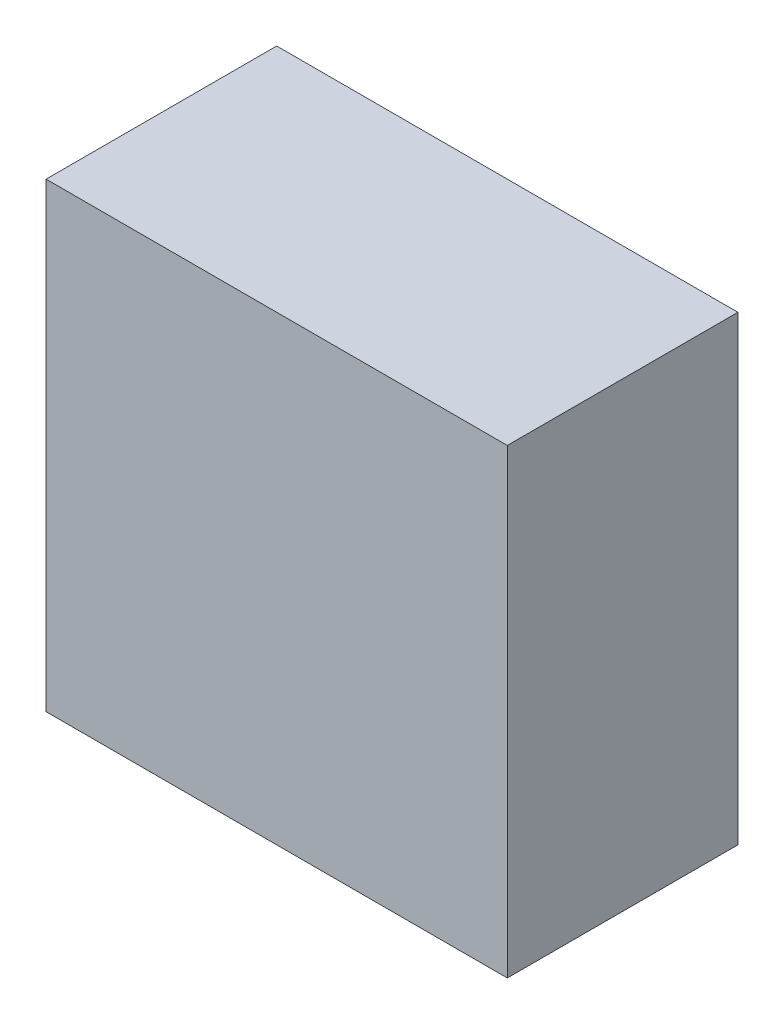
ISO-10303-21;
HEADER;
FILE_DESCRIPTION(('STEP AP214'),'2;1');
FILE_NAME('part.step','',(''),(''),'','','');
FILE_SCHEMA(('AUTOMOTIVE_DESIGN { 1 0 10303 214 1 1 1 1 }'));
ENDSEC;
DATA;
#1=APPLICATION_CONTEXT('core data for automotive mechanical design processes');
#2=APPLICATION_PROTOCOL_DEFINITION('international standard','automotive_design',2000,#1);
#3=PRODUCT_CONTEXT('',#1,'mechanical');
#4=PRODUCT('Part','Part','',(#3));
#5=PRODUCT_RELATED_PRODUCT_CATEGORY('part','',(#4));
#6=PRODUCT_DEFINITION_FORMATION('','',#4);
#7=PRODUCT_DEFINITION_CONTEXT('part definition',#1,'design');
#8=PRODUCT_DEFINITION('design','',#6,#7);
#9=PRODUCT_DEFINITION_SHAPE('','',#8);
#10=(LENGTH_UNIT() NAMED_UNIT(*) SI_UNIT(.MILLI.,.METRE.));
#11=(NAMED_UNIT(*) PLANE_ANGLE_UNIT() SI_UNIT($,.RADIAN.));
#12=(NAMED_UNIT(*) SI_UNIT($,.STERADIAN.) SOLID_ANGLE_UNIT());
#13=UNCERTAINTY_MEASURE_WITH_UNIT(LENGTH_MEASURE(1.E-05),#10,'distance_accuracy_value','');
#14=(GEOMETRIC_REPRESENTATION_CONTEXT(3) GLOBAL_UNCERTAINTY_ASSIGNED_CONTEXT((#13)) GLOBAL_UNIT_ASSIGNED_CONTEXT((#10,
#11,#12)) REPRESENTATION_CONTEXT('',''));
#15=CARTESIAN_POINT('',(0.,0.,0.));
#16=DIRECTION('',(0.,0.,1.));
#17=DIRECTION('',(1.,0.,0.));
#18=AXIS2_PLACEMENT_3D('',#15,#16,#17);
#19=CARTESIAN_POINT('',(10.,-10.,10.));
#20=DIRECTION('',(-1.,0.,0.));
#21=DIRECTION('',(0.,0.,1.));
#22=AXIS2_PLACEMENT_3D('',#19,#20,#21);
#23=PLANE('',#22);
#24=DIRECTION('',(0.,1.,0.));
#25=VECTOR('',#24,1.);
#26=CARTESIAN_POINT('',(10.,-10.,0.));
#27=LINE('',#26,#25);
#28=CARTESIAN_POINT('',(10.,-10.,0.));
#29=VERTEX_POINT('',#28);
#30=CARTESIAN_POINT('',(10.,10.,0.));
#31=VERTEX_POINT('',#30);
#32=EDGE_CURVE('E301',#29,#31,#27,.T.);
#33=ORIENTED_EDGE('',*,*,#32,.T.);
#34=DIRECTION('',(0.,0.,-1.));
#35=VECTOR('',#34,1.);
#36=CARTESIAN_POINT('',(10.,10.,10.));
#37=LINE('',#36,#35);
#38=CARTESIAN_POINT('',(10.,10.,10.));
#39=VERTEX_POINT('',#38);
#40=EDGE_CURVE('E42',#39,#31,#37,.T.);
#41=ORIENTED_EDGE('',*,*,#40,.F.);
#42=DIRECTION('',(0.,1.,0.));
#43=VECTOR('',#42,1.);
#44=CARTESIAN_POINT('',(10.,-10.,10.));
#45=LINE('',#44,#43);
#46=CARTESIAN_POINT('',(10.,-10.,10.));
#47=VERTEX_POINT('',#46);
#48=EDGE_CURVE('E307',#47,#39,#45,.T.);
#49=ORIENTED_EDGE('',*,*,#48,.F.);
#50=DIRECTION('',(0.,0.,-1.));
#51=VECTOR('',#50,1.);
#52=CARTESIAN_POINT('',(10.,-10.,10.));
#53=LINE('',#52,#51);
#54=EDGE_CURVE('E317',#47,#29,#53,.T.);
#55=ORIENTED_EDGE('',*,*,#54,.T.);
#56=EDGE_LOOP('',(#33,#41,#49,#55));
#57=FACE_BOUND('',#56,.T.);
#58=ADVANCED_FACE('F35',(#57),#23,.F.);
#59=CARTESIAN_POINT('',(-10.,10.,10.));
#60=DIRECTION('',(0.,-1.,0.));
#61=DIRECTION('',(0.,0.,-1.));
#62=AXIS2_PLACEMENT_3D('',#59,#60,#61);
#63=PLANE('',#62);
#64=DIRECTION('',(-1.,0.,0.));
#65=VECTOR('',#64,1.);
#66=CARTESIAN_POINT('',(-10.,10.,0.));
#67=LINE('',#66,#65);
#68=CARTESIAN_POINT('',(-10.,10.,0.));
#69=VERTEX_POINT('',#68);
#70=EDGE_CURVE('E320',#31,#69,#67,.T.);
#71=ORIENTED_EDGE('',*,*,#70,.T.);
#72=DIRECTION('',(0.,0.,-1.));
#73=VECTOR('',#72,1.);
#74=CARTESIAN_POINT('',(-10.,10.,10.));
#75=LINE('',#74,#73);
#76=CARTESIAN_POINT('',(-10.,10.,10.));
#77=VERTEX_POINT('',#76);
#78=EDGE_CURVE('E330',#77,#69,#75,.T.);
#79=ORIENTED_EDGE('',*,*,#78,.F.);
#80=DIRECTION('',(-1.,0.,0.));
#81=VECTOR('',#80,1.);
#82=CARTESIAN_POINT('',(-10.,10.,10.));
#83=LINE('',#82,#81);
#84=EDGE_CURVE('E310',#39,#77,#83,.T.);
#85=ORIENTED_EDGE('',*,*,#84,.F.);
#86=ORIENTED_EDGE('',*,*,#40,.T.);
#87=EDGE_LOOP('',(#71,#79,#85,#86));
#88=FACE_BOUND('',#87,.T.);
#89=ADVANCED_FACE('F335',(#88),#63,.F.);
#90=CARTESIAN_POINT('',(-10.,-10.,10.));
#91=DIRECTION('',(1.,0.,0.));
#92=DIRECTION('',(0.,0.,-1.));
#93=AXIS2_PLACEMENT_3D('',#90,#91,#92);
#94=PLANE('',#93);
#95=DIRECTION('',(0.,-1.,0.));
#96=VECTOR('',#95,1.);
#97=CARTESIAN_POINT('',(-10.,-10.,0.));
#98=LINE('',#97,#96);
#99=CARTESIAN_POINT('',(-10.,-10.,0.));
#100=VERTEX_POINT('',#99);
#101=EDGE_CURVE('E322',#69,#100,#98,.T.);
#102=ORIENTED_EDGE('',*,*,#101,.T.);
#103=DIRECTION('',(0.,0.,-1.));
#104=VECTOR('',#103,1.);
#105=CARTESIAN_POINT('',(-10.,-10.,10.));
#106=LINE('',#105,#104);
#107=CARTESIAN_POINT('',(-10.,-10.,10.));
#108=VERTEX_POINT('',#107);
#109=EDGE_CURVE('E327',#108,#100,#106,.T.);
#110=ORIENTED_EDGE('',*,*,#109,.F.);
#111=DIRECTION('',(0.,-1.,0.));
#112=VECTOR('',#111,1.);
#113=CARTESIAN_POINT('',(-10.,-10.,10.));
#114=LINE('',#113,#112);
#115=EDGE_CURVE('E313',#77,#108,#114,.T.);
#116=ORIENTED_EDGE('',*,*,#115,.F.);
#117=ORIENTED_EDGE('',*,*,#78,.T.);
#118=EDGE_LOOP('',(#102,#110,#116,#117));
#119=FACE_BOUND('',#118,.T.);
#120=ADVANCED_FACE('F347',(#119),#94,.F.);
#121=CARTESIAN_POINT('',(-10.,-10.,10.));
#122=DIRECTION('',(0.,1.,0.));
#123=DIRECTION('',(0.,0.,1.));
#124=AXIS2_PLACEMENT_3D('',#121,#122,#123);
#125=PLANE('',#124);
#126=DIRECTION('',(1.,0.,0.));
#127=VECTOR('',#126,1.);
#128=CARTESIAN_POINT('',(-10.,-10.,0.));
#129=LINE('',#128,#127);
#130=EDGE_CURVE('E311',#100,#29,#129,.T.);
#131=ORIENTED_EDGE('',*,*,#130,.T.);
#132=ORIENTED_EDGE('',*,*,#54,.F.);
#133=DIRECTION('',(1.,0.,0.));
#134=VECTOR('',#133,1.);
#135=CARTESIAN_POINT('',(-10.,-10.,10.));
#136=LINE('',#135,#134);
#137=EDGE_CURVE('E315',#108,#47,#136,.T.);
#138=ORIENTED_EDGE('',*,*,#137,.F.);
#139=ORIENTED_EDGE('',*,*,#109,.T.);
#140=EDGE_LOOP('',(#131,#132,#138,#139));
#141=FACE_BOUND('',#140,.T.);
#142=ADVANCED_FACE('F351',(#141),#125,.F.);
#143=CARTESIAN_POINT('',(0.,0.,10.));
#144=DIRECTION('',(0.,0.,-1.));
#145=DIRECTION('',(-1.,0.,0.));
#146=AXIS2_PLACEMENT_3D('',#143,#144,#145);
#147=PLANE('',#146);
#148=ORIENTED_EDGE('',*,*,#48,.T.);
#149=ORIENTED_EDGE('',*,*,#84,.T.);
#150=ORIENTED_EDGE('',*,*,#115,.T.);
#151=ORIENTED_EDGE('',*,*,#137,.T.);
#152=EDGE_LOOP('',(#148,#149,#150,#151));
#153=FACE_BOUND('',#152,.T.);
#154=ADVANCED_FACE('F353',(#153),#147,.F.);
#155=CARTESIAN_POINT('',(0.,0.,0.));
#156=DIRECTION('',(0.,0.,-1.));
#157=DIRECTION('',(-1.,0.,0.));
#158=AXIS2_PLACEMENT_3D('',#155,#156,#157);
#159=PLANE('',#158);
#160=DIRECTION('',(0.,1.,0.));
#161=VECTOR('',#160,1.);
#162=CARTESIAN_POINT('',(-8.5,-8.5,0.));
#163=LINE('',#162,#161);
#164=CARTESIAN_POINT('',(-8.5,-8.5,0.));
#165=VERTEX_POINT('',#164);
#166=CARTESIAN_POINT('',(-8.5,8.5,0.));
#167=VERTEX_POINT('',#166);
#168=EDGE_CURVE('E57',#165,#167,#163,.T.);
#169=ORIENTED_EDGE('',*,*,#168,.F.);
#170=DIRECTION('',(-1.,0.,0.));
#171=VECTOR('',#170,1.);
#172=CARTESIAN_POINT('',(8.5,-8.5,0.));
#173=LINE('',#172,#171);
#174=CARTESIAN_POINT('',(8.5,-8.5,0.));
#175=VERTEX_POINT('',#174);
#176=EDGE_CURVE('E280',#175,#165,#173,.T.);
#177=ORIENTED_EDGE('',*,*,#176,.F.);
#178=DIRECTION('',(0.,-1.,0.));
#179=VECTOR('',#178,1.);
#180=CARTESIAN_POINT('',(8.5,-8.5,0.));
#181=LINE('',#180,#179);
#182=CARTESIAN_POINT('',(8.5,8.5,0.));
#183=VERTEX_POINT('',#182);
#184=EDGE_CURVE('E294',#183,#175,#181,.T.);
#185=ORIENTED_EDGE('',*,*,#184,.F.);
#186=DIRECTION('',(1.,0.,0.));
#187=VECTOR('',#186,1.);
#188=CARTESIAN_POINT('',(8.5,8.5,0.));
#189=LINE('',#188,#187);
#190=EDGE_CURVE('E291',#167,#183,#189,.T.);
#191=ORIENTED_EDGE('',*,*,#190,.F.);
#192=EDGE_LOOP('',(#169,#177,#185,#191));
#193=FACE_BOUND('',#192,.T.);
#194=ORIENTED_EDGE('',*,*,#32,.F.);
#195=ORIENTED_EDGE('',*,*,#130,.F.);
#196=ORIENTED_EDGE('',*,*,#101,.F.);
#197=ORIENTED_EDGE('',*,*,#70,.F.);
#198=EDGE_LOOP('',(#194,#195,#196,#197));
#199=FACE_BOUND('',#198,.T.);
#200=ADVANCED_FACE('F343',(#193,#199),#159,.T.);
#201=CARTESIAN_POINT('',(-8.5,-8.5,7.5));
#202=DIRECTION('',(-1.,0.,0.));
#203=DIRECTION('',(0.,0.,1.));
#204=AXIS2_PLACEMENT_3D('',#201,#202,#203);
#205=PLANE('',#204);
#206=ORIENTED_EDGE('',*,*,#168,.T.);
#207=DIRECTION('',(0.,0.,-1.));
#208=VECTOR('',#207,1.);
#209=CARTESIAN_POINT('',(-8.5,8.5,7.5));
#210=LINE('',#209,#208);
#211=CARTESIAN_POINT('',(-8.5,8.5,7.5));
#212=VERTEX_POINT('',#211);
#213=EDGE_CURVE('E289',#212,#167,#210,.T.);
#214=ORIENTED_EDGE('',*,*,#213,.F.);
#215=DIRECTION('',(0.,1.,0.));
#216=VECTOR('',#215,1.);
#217=CARTESIAN_POINT('',(-8.5,-8.5,7.5));
#218=LINE('',#217,#216);
#219=CARTESIAN_POINT('',(-8.5,-8.5,7.5));
#220=VERTEX_POINT('',#219);
#221=EDGE_CURVE('E276',#220,#212,#218,.T.);
#222=ORIENTED_EDGE('',*,*,#221,.F.);
#223=DIRECTION('',(0.,0.,-1.));
#224=VECTOR('',#223,1.);
#225=CARTESIAN_POINT('',(-8.5,-8.5,7.5));
#226=LINE('',#225,#224);
#227=EDGE_CURVE('E299',#220,#165,#226,.T.);
#228=ORIENTED_EDGE('',*,*,#227,.T.);
#229=EDGE_LOOP('',(#206,#214,#222,#228));
#230=FACE_BOUND('',#229,.T.);
#231=ADVANCED_FACE('F360',(#230),#205,.F.);
#232=CARTESIAN_POINT('',(8.5,-8.5,7.5));
#233=DIRECTION('',(0.,-1.,0.));
#234=DIRECTION('',(0.,0.,-1.));
#235=AXIS2_PLACEMENT_3D('',#232,#233,#234);
#236=PLANE('',#235);
#237=ORIENTED_EDGE('',*,*,#176,.T.);
#238=ORIENTED_EDGE('',*,*,#227,.F.);
#239=DIRECTION('',(-1.,0.,0.));
#240=VECTOR('',#239,1.);
#241=CARTESIAN_POINT('',(8.5,-8.5,7.5));
#242=LINE('',#241,#240);
#243=CARTESIAN_POINT('',(8.5,-8.5,7.5));
#244=VERTEX_POINT('',#243);
#245=EDGE_CURVE('E286',#244,#220,#242,.T.);
#246=ORIENTED_EDGE('',*,*,#245,.F.);
#247=DIRECTION('',(0.,0.,-1.));
#248=VECTOR('',#247,1.);
#249=CARTESIAN_POINT('',(8.5,-8.5,7.5));
#250=LINE('',#249,#248);
#251=EDGE_CURVE('E302',#244,#175,#250,.T.);
#252=ORIENTED_EDGE('',*,*,#251,.T.);
#253=EDGE_LOOP('',(#237,#238,#246,#252));
#254=FACE_BOUND('',#253,.T.);
#255=ADVANCED_FACE('F398',(#254),#236,.F.);
#256=CARTESIAN_POINT('',(8.5,-8.5,7.5));
#257=DIRECTION('',(1.,0.,0.));
#258=DIRECTION('',(0.,0.,-1.));
#259=AXIS2_PLACEMENT_3D('',#256,#257,#258);
#260=PLANE('',#259);
#261=ORIENTED_EDGE('',*,*,#184,.T.);
#262=ORIENTED_EDGE('',*,*,#251,.F.);
#263=DIRECTION('',(0.,-1.,0.));
#264=VECTOR('',#263,1.);
#265=CARTESIAN_POINT('',(8.5,-8.5,7.5));
#266=LINE('',#265,#264);
#267=CARTESIAN_POINT('',(8.5,8.5,7.5));
#268=VERTEX_POINT('',#267);
#269=EDGE_CURVE('E283',#268,#244,#266,.T.);
#270=ORIENTED_EDGE('',*,*,#269,.F.);
#271=DIRECTION('',(0.,0.,-1.));
#272=VECTOR('',#271,1.);
#273=CARTESIAN_POINT('',(8.5,8.5,7.5));
#274=LINE('',#273,#272);
#275=EDGE_CURVE('E304',#268,#183,#274,.T.);
#276=ORIENTED_EDGE('',*,*,#275,.T.);
#277=EDGE_LOOP('',(#261,#262,#270,#276));
#278=FACE_BOUND('',#277,.T.);
#279=ADVANCED_FACE('F406',(#278),#260,.F.);
#280=CARTESIAN_POINT('',(8.5,8.5,7.5));
#281=DIRECTION('',(0.,1.,0.));
#282=DIRECTION('',(0.,0.,1.));
#283=AXIS2_PLACEMENT_3D('',#280,#281,#282);
#284=PLANE('',#283);
#285=ORIENTED_EDGE('',*,*,#190,.T.);
#286=ORIENTED_EDGE('',*,*,#275,.F.);
#287=DIRECTION('',(1.,0.,0.));
#288=VECTOR('',#287,1.);
#289=CARTESIAN_POINT('',(8.5,8.5,7.5));
#290=LINE('',#289,#288);
#291=EDGE_CURVE('E279',#212,#268,#290,.T.);
#292=ORIENTED_EDGE('',*,*,#291,.F.);
#293=ORIENTED_EDGE('',*,*,#213,.T.);
#294=EDGE_LOOP('',(#285,#286,#292,#293));
#295=FACE_BOUND('',#294,.T.);
#296=ADVANCED_FACE('F416',(#295),#284,.F.);
#297=CARTESIAN_POINT('',(0.,0.,7.5));
#298=DIRECTION('',(0.,0.,1.));
#299=DIRECTION('',(1.,0.,0.));
#300=AXIS2_PLACEMENT_3D('',#297,#298,#299);
#301=PLANE('',#300);
#302=CARTESIAN_POINT('',(0.,0.,7.5));
#303=DIRECTION('',(0.,0.,1.));
#304=DIRECTION('',(1.,0.,0.));
#305=AXIS2_PLACEMENT_3D('',#302,#303,#304);
#306=CIRCLE('',#305,2.65);
#307=CARTESIAN_POINT('',(2.65,0.,7.5));
#308=VERTEX_POINT('',#307);
#309=EDGE_CURVE('E11',#308,#308,#306,.F.);
#310=ORIENTED_EDGE('',*,*,#309,.F.);
#311=EDGE_LOOP('',(#310));
#312=FACE_BOUND('',#311,.T.);
#313=ORIENTED_EDGE('',*,*,#221,.T.);
#314=ORIENTED_EDGE('',*,*,#291,.T.);
#315=ORIENTED_EDGE('',*,*,#269,.T.);
#316=ORIENTED_EDGE('',*,*,#245,.T.);
#317=EDGE_LOOP('',(#313,#314,#315,#316));
#318=FACE_BOUND('',#317,.T.);
#319=ADVANCED_FACE('F426',(#312,#318),#301,.F.);
#320=CARTESIAN_POINT('',(0.,0.,0.));
#321=DIRECTION('',(0.,0.,1.));
#322=DIRECTION('',(1.,0.,0.));
#323=AXIS2_PLACEMENT_3D('',#320,#321,#322);
#324=CYLINDRICAL_SURFACE('',#323,2.65);
#325=CARTESIAN_POINT('',(0.,0.,0.));
#326=DIRECTION('',(0.,0.,-1.));
#327=DIRECTION('',(-1.,0.,0.));
#328=AXIS2_PLACEMENT_3D('',#325,#326,#327);
#329=CIRCLE('',#328,2.65);
#330=CARTESIAN_POINT('',(-2.65,0.,0.));
#331=VERTEX_POINT('',#330);
#332=EDGE_CURVE('E254',#331,#331,#329,.T.);
#333=ORIENTED_EDGE('',*,*,#332,.F.);
#334=EDGE_LOOP('',(#333));
#335=FACE_BOUND('',#334,.T.);
#336=ORIENTED_EDGE('',*,*,#309,.T.);
#337=EDGE_LOOP('',(#336));
#338=FACE_BOUND('',#337,.T.);
#339=ADVANCED_FACE('F436',(#335,#338),#324,.T.);
#340=CARTESIAN_POINT('',(0.,0.,0.));
#341=DIRECTION('',(0.,0.,-1.));
#342=DIRECTION('',(-1.,0.,0.));
#343=AXIS2_PLACEMENT_3D('',#340,#341,#342);
#344=PLANE('',#343);
#345=DIRECTION('',(-1.,0.,0.));
#346=VECTOR('',#345,1.);
#347=CARTESIAN_POINT('',(-0.585,-0.585,0.));
#348=LINE('',#347,#346);
#349=CARTESIAN_POINT('',(-0.585,-0.585,0.));
#350=VERTEX_POINT('',#349);
#351=CARTESIAN_POINT('',(-2.05,-0.585,0.));
#352=VERTEX_POINT('',#351);
#353=EDGE_CURVE('E49',#350,#352,#348,.T.);
#354=ORIENTED_EDGE('',*,*,#353,.F.);
#355=DIRECTION('',(0.,1.,0.));
#356=VECTOR('',#355,1.);
#357=CARTESIAN_POINT('',(-0.585,-2.05,0.));
#358=LINE('',#357,#356);
#359=CARTESIAN_POINT('',(-0.585,-2.05,0.));
#360=VERTEX_POINT('',#359);
#361=EDGE_CURVE('E192',#360,#350,#358,.T.);
#362=ORIENTED_EDGE('',*,*,#361,.F.);
#363=DIRECTION('',(-1.,0.,0.));
#364=VECTOR('',#363,1.);
#365=CARTESIAN_POINT('',(0.585,-2.05,0.));
#366=LINE('',#365,#364);
#367=CARTESIAN_POINT('',(0.585,-2.05,0.));
#368=VERTEX_POINT('',#367);
#369=EDGE_CURVE('E195',#368,#360,#366,.T.);
#370=ORIENTED_EDGE('',*,*,#369,.F.);
#371=DIRECTION('',(0.,-1.,0.));
#372=VECTOR('',#371,1.);
#373=CARTESIAN_POINT('',(0.585,-2.05,0.));
#374=LINE('',#373,#372);
#375=CARTESIAN_POINT('',(0.585,-0.585,0.));
#376=VERTEX_POINT('',#375);
#377=EDGE_CURVE('E247',#376,#368,#374,.T.);
#378=ORIENTED_EDGE('',*,*,#377,.F.);
#379=DIRECTION('',(-1.,0.,0.));
#380=VECTOR('',#379,1.);
#381=CARTESIAN_POINT('',(0.585,-0.585,0.));
#382=LINE('',#381,#380);
#383=CARTESIAN_POINT('',(2.05,-0.585,0.));
#384=VERTEX_POINT('',#383);
#385=EDGE_CURVE('E244',#384,#376,#382,.T.);
#386=ORIENTED_EDGE('',*,*,#385,.F.);
#387=DIRECTION('',(0.,-1.,0.));
#388=VECTOR('',#387,1.);
#389=CARTESIAN_POINT('',(2.05,0.585,0.));
#390=LINE('',#389,#388);
#391=CARTESIAN_POINT('',(2.05,0.585,0.));
#392=VERTEX_POINT('',#391);
#393=EDGE_CURVE('E241',#392,#384,#390,.T.);
#394=ORIENTED_EDGE('',*,*,#393,.F.);
#395=DIRECTION('',(1.,0.,0.));
#396=VECTOR('',#395,1.);
#397=CARTESIAN_POINT('',(0.585,0.585,0.));
#398=LINE('',#397,#396);
#399=CARTESIAN_POINT('',(0.585,0.585,0.));
#400=VERTEX_POINT('',#399);
#401=EDGE_CURVE('E238',#400,#392,#398,.T.);
#402=ORIENTED_EDGE('',*,*,#401,.F.);
#403=DIRECTION('',(0.,-1.,0.));
#404=VECTOR('',#403,1.);
#405=CARTESIAN_POINT('',(0.585,2.05,0.));
#406=LINE('',#405,#404);
#407=CARTESIAN_POINT('',(0.585,2.05,0.));
#408=VERTEX_POINT('',#407);
#409=EDGE_CURVE('E235',#408,#400,#406,.T.);
#410=ORIENTED_EDGE('',*,*,#409,.F.);
#411=DIRECTION('',(1.,0.,0.));
#412=VECTOR('',#411,1.);
#413=CARTESIAN_POINT('',(0.585,2.05,0.));
#414=LINE('',#413,#412);
#415=CARTESIAN_POINT('',(-0.585,2.05,0.));
#416=VERTEX_POINT('',#415);
#417=EDGE_CURVE('E232',#416,#408,#414,.T.);
#418=ORIENTED_EDGE('',*,*,#417,.F.);
#419=DIRECTION('',(0.,1.,0.));
#420=VECTOR('',#419,1.);
#421=CARTESIAN_POINT('',(-0.585,2.05,0.));
#422=LINE('',#421,#420);
#423=CARTESIAN_POINT('',(-0.585,0.585,0.));
#424=VERTEX_POINT('',#423);
#425=EDGE_CURVE('E229',#424,#416,#422,.T.);
#426=ORIENTED_EDGE('',*,*,#425,.F.);
#427=DIRECTION('',(1.,0.,0.));
#428=VECTOR('',#427,1.);
#429=CARTESIAN_POINT('',(-0.585,0.585,0.));
#430=LINE('',#429,#428);
#431=CARTESIAN_POINT('',(-2.05,0.585,0.));
#432=VERTEX_POINT('',#431);
#433=EDGE_CURVE('E226',#432,#424,#430,.T.);
#434=ORIENTED_EDGE('',*,*,#433,.F.);
#435=DIRECTION('',(0.,1.,0.));
#436=VECTOR('',#435,1.);
#437=CARTESIAN_POINT('',(-2.05,0.585,0.));
#438=LINE('',#437,#436);
#439=EDGE_CURVE('E224',#352,#432,#438,.T.);
#440=ORIENTED_EDGE('',*,*,#439,.F.);
#441=EDGE_LOOP('',(#354,#362,#370,#378,#386,#394,#402,#410,#418,#426,#434,#440));
#442=FACE_BOUND('',#441,.T.);
#443=ORIENTED_EDGE('',*,*,#332,.T.);
#444=EDGE_LOOP('',(#443));
#445=FACE_BOUND('',#444,.T.);
#446=ADVANCED_FACE('F446',(#442,#445),#344,.T.);
#447=CARTESIAN_POINT('',(-0.585,-0.585,7.5));
#448=DIRECTION('',(0.,-1.,0.));
#449=DIRECTION('',(1.,0.,0.));
#450=AXIS2_PLACEMENT_3D('',#447,#448,#449);
#451=PLANE('',#450);
#452=ORIENTED_EDGE('',*,*,#353,.T.);
#453=DIRECTION('',(0.,0.,-1.));
#454=VECTOR('',#453,1.);
#455=CARTESIAN_POINT('',(-2.05,-0.585,7.5));
#456=LINE('',#455,#454);
#457=CARTESIAN_POINT('',(-2.05,-0.585,7.5));
#458=VERTEX_POINT('',#457);
#459=EDGE_CURVE('E169',#458,#352,#456,.T.);
#460=ORIENTED_EDGE('',*,*,#459,.F.);
#461=DIRECTION('',(-1.,0.,0.));
#462=VECTOR('',#461,1.);
#463=CARTESIAN_POINT('',(-0.585,-0.585,7.5));
#464=LINE('',#463,#462);
#465=CARTESIAN_POINT('',(-0.585,-0.585,7.5));
#466=VERTEX_POINT('',#465);
#467=EDGE_CURVE('E173',#466,#458,#464,.T.);
#468=ORIENTED_EDGE('',*,*,#467,.F.);
#469=DIRECTION('',(0.,0.,-1.));
#470=VECTOR('',#469,1.);
#471=CARTESIAN_POINT('',(-0.585,-0.585,7.5));
#472=LINE('',#471,#470);
#473=EDGE_CURVE('E252',#466,#350,#472,.T.);
#474=ORIENTED_EDGE('',*,*,#473,.T.);
#475=EDGE_LOOP('',(#452,#460,#468,#474));
#476=FACE_BOUND('',#475,.T.);
#477=ADVANCED_FACE('F171',(#476),#451,.F.);
#478=CARTESIAN_POINT('',(-0.585,-2.05,7.5));
#479=DIRECTION('',(-1.,0.,0.));
#480=DIRECTION('',(0.,-1.,0.));
#481=AXIS2_PLACEMENT_3D('',#478,#479,#480);
#482=PLANE('',#481);
#483=ORIENTED_EDGE('',*,*,#361,.T.);
#484=ORIENTED_EDGE('',*,*,#473,.F.);
#485=DIRECTION('',(0.,1.,0.));
#486=VECTOR('',#485,1.);
#487=CARTESIAN_POINT('',(-0.585,-2.05,7.5));
#488=LINE('',#487,#486);
#489=CARTESIAN_POINT('',(-0.585,-2.05,7.5));
#490=VERTEX_POINT('',#489);
#491=EDGE_CURVE('E179',#490,#466,#488,.T.);
#492=ORIENTED_EDGE('',*,*,#491,.F.);
#493=DIRECTION('',(0.,0.,-1.));
#494=VECTOR('',#493,1.);
#495=CARTESIAN_POINT('',(-0.585,-2.05,7.5));
#496=LINE('',#495,#494);
#497=EDGE_CURVE('E255',#490,#360,#496,.T.);
#498=ORIENTED_EDGE('',*,*,#497,.T.);
#499=EDGE_LOOP('',(#483,#484,#492,#498));
#500=FACE_BOUND('',#499,.T.);
#501=ADVANCED_FACE('F465',(#500),#482,.F.);
#502=CARTESIAN_POINT('',(0.585,-2.05,7.5));
#503=DIRECTION('',(0.,-1.,0.));
#504=DIRECTION('',(0.,0.,-1.));
#505=AXIS2_PLACEMENT_3D('',#502,#503,#504);
#506=PLANE('',#505);
#507=ORIENTED_EDGE('',*,*,#369,.T.);
#508=ORIENTED_EDGE('',*,*,#497,.F.);
#509=DIRECTION('',(-1.,0.,0.));
#510=VECTOR('',#509,1.);
#511=CARTESIAN_POINT('',(0.585,-2.05,7.5));
#512=LINE('',#511,#510);
#513=CARTESIAN_POINT('',(0.585,-2.05,7.5));
#514=VERTEX_POINT('',#513);
#515=EDGE_CURVE('E220',#514,#490,#512,.T.);
#516=ORIENTED_EDGE('',*,*,#515,.F.);
#517=DIRECTION('',(0.,0.,-1.));
#518=VECTOR('',#517,1.);
#519=CARTESIAN_POINT('',(0.585,-2.05,7.5));
#520=LINE('',#519,#518);
#521=EDGE_CURVE('E257',#514,#368,#520,.T.);
#522=ORIENTED_EDGE('',*,*,#521,.T.);
#523=EDGE_LOOP('',(#507,#508,#516,#522));
#524=FACE_BOUND('',#523,.T.);
#525=ADVANCED_FACE('F474',(#524),#506,.F.);
#526=CARTESIAN_POINT('',(0.585,-2.05,7.5));
#527=DIRECTION('',(1.,0.,0.));
#528=DIRECTION('',(0.,1.,0.));
#529=AXIS2_PLACEMENT_3D('',#526,#527,#528);
#530=PLANE('',#529);
#531=ORIENTED_EDGE('',*,*,#377,.T.);
#532=ORIENTED_EDGE('',*,*,#521,.F.);
#533=DIRECTION('',(0.,-1.,0.));
#534=VECTOR('',#533,1.);
#535=CARTESIAN_POINT('',(0.585,-2.05,7.5));
#536=LINE('',#535,#534);
#537=CARTESIAN_POINT('',(0.585,-0.585,7.5));
#538=VERTEX_POINT('',#537);
#539=EDGE_CURVE('E217',#538,#514,#536,.T.);
#540=ORIENTED_EDGE('',*,*,#539,.F.);
#541=DIRECTION('',(0.,0.,-1.));
#542=VECTOR('',#541,1.);
#543=CARTESIAN_POINT('',(0.585,-0.585,7.5));
#544=LINE('',#543,#542);
#545=EDGE_CURVE('E259',#538,#376,#544,.T.);
#546=ORIENTED_EDGE('',*,*,#545,.T.);
#547=EDGE_LOOP('',(#531,#532,#540,#546));
#548=FACE_BOUND('',#547,.T.);
#549=ADVANCED_FACE('F484',(#548),#530,.F.);
#550=CARTESIAN_POINT('',(0.585,-0.585,7.5));
#551=DIRECTION('',(0.,-1.,0.));
#552=DIRECTION('',(1.,0.,0.));
#553=AXIS2_PLACEMENT_3D('',#550,#551,#552);
#554=PLANE('',#553);
#555=ORIENTED_EDGE('',*,*,#385,.T.);
#556=ORIENTED_EDGE('',*,*,#545,.F.);
#557=DIRECTION('',(-1.,0.,0.));
#558=VECTOR('',#557,1.);
#559=CARTESIAN_POINT('',(0.585,-0.585,7.5));
#560=LINE('',#559,#558);
#561=CARTESIAN_POINT('',(2.05,-0.585,7.5));
#562=VERTEX_POINT('',#561);
#563=EDGE_CURVE('E214',#562,#538,#560,.T.);
#564=ORIENTED_EDGE('',*,*,#563,.F.);
#565=DIRECTION('',(0.,0.,-1.));
#566=VECTOR('',#565,1.);
#567=CARTESIAN_POINT('',(2.05,-0.585,7.5));
#568=LINE('',#567,#566);
#569=EDGE_CURVE('E261',#562,#384,#568,.T.);
#570=ORIENTED_EDGE('',*,*,#569,.T.);
#571=EDGE_LOOP('',(#555,#556,#564,#570));
#572=FACE_BOUND('',#571,.T.);
#573=ADVANCED_FACE('F494',(#572),#554,.F.);
#574=CARTESIAN_POINT('',(2.05,0.585,7.5));
#575=DIRECTION('',(1.,0.,0.));
#576=DIRECTION('',(0.,0.,-1.));
#577=AXIS2_PLACEMENT_3D('',#574,#575,#576);
#578=PLANE('',#577);
#579=ORIENTED_EDGE('',*,*,#393,.T.);
#580=ORIENTED_EDGE('',*,*,#569,.F.);
#581=DIRECTION('',(0.,-1.,0.));
#582=VECTOR('',#581,1.);
#583=CARTESIAN_POINT('',(2.05,0.585,7.5));
#584=LINE('',#583,#582);
#585=CARTESIAN_POINT('',(2.05,0.585,7.5));
#586=VERTEX_POINT('',#585);
#587=EDGE_CURVE('E211',#586,#562,#584,.T.);
#588=ORIENTED_EDGE('',*,*,#587,.F.);
#589=DIRECTION('',(0.,0.,-1.));
#590=VECTOR('',#589,1.);
#591=CARTESIAN_POINT('',(2.05,0.585,7.5));
#592=LINE('',#591,#590);
#593=EDGE_CURVE('E263',#586,#392,#592,.T.);
#594=ORIENTED_EDGE('',*,*,#593,.T.);
#595=EDGE_LOOP('',(#579,#580,#588,#594));
#596=FACE_BOUND('',#595,.T.);
#597=ADVANCED_FACE('F504',(#596),#578,.F.);
#598=CARTESIAN_POINT('',(0.585,0.585,7.5));
#599=DIRECTION('',(0.,1.,0.));
#600=DIRECTION('',(-1.,0.,0.));
#601=AXIS2_PLACEMENT_3D('',#598,#599,#600);
#602=PLANE('',#601);
#603=ORIENTED_EDGE('',*,*,#401,.T.);
#604=ORIENTED_EDGE('',*,*,#593,.F.);
#605=DIRECTION('',(1.,0.,0.));
#606=VECTOR('',#605,1.);
#607=CARTESIAN_POINT('',(0.585,0.585,7.5));
#608=LINE('',#607,#606);
#609=CARTESIAN_POINT('',(0.585,0.585,7.5));
#610=VERTEX_POINT('',#609);
#611=EDGE_CURVE('E208',#610,#586,#608,.T.);
#612=ORIENTED_EDGE('',*,*,#611,.F.);
#613=DIRECTION('',(0.,0.,-1.));
#614=VECTOR('',#613,1.);
#615=CARTESIAN_POINT('',(0.585,0.585,7.5));
#616=LINE('',#615,#614);
#617=EDGE_CURVE('E265',#610,#400,#616,.T.);
#618=ORIENTED_EDGE('',*,*,#617,.T.);
#619=EDGE_LOOP('',(#603,#604,#612,#618));
#620=FACE_BOUND('',#619,.T.);
#621=ADVANCED_FACE('F514',(#620),#602,.F.);
#622=CARTESIAN_POINT('',(0.585,2.05,7.5));
#623=DIRECTION('',(1.,0.,0.));
#624=DIRECTION('',(0.,1.,0.));
#625=AXIS2_PLACEMENT_3D('',#622,#623,#624);
#626=PLANE('',#625);
#627=ORIENTED_EDGE('',*,*,#409,.T.);
#628=ORIENTED_EDGE('',*,*,#617,.F.);
#629=DIRECTION('',(0.,-1.,0.));
#630=VECTOR('',#629,1.);
#631=CARTESIAN_POINT('',(0.585,2.05,7.5));
#632=LINE('',#631,#630);
#633=CARTESIAN_POINT('',(0.585,2.05,7.5));
#634=VERTEX_POINT('',#633);
#635=EDGE_CURVE('E205',#634,#610,#632,.T.);
#636=ORIENTED_EDGE('',*,*,#635,.F.);
#637=DIRECTION('',(0.,0.,-1.));
#638=VECTOR('',#637,1.);
#639=CARTESIAN_POINT('',(0.585,2.05,7.5));
#640=LINE('',#639,#638);
#641=EDGE_CURVE('E267',#634,#408,#640,.T.);
#642=ORIENTED_EDGE('',*,*,#641,.T.);
#643=EDGE_LOOP('',(#627,#628,#636,#642));
#644=FACE_BOUND('',#643,.T.);
#645=ADVANCED_FACE('F524',(#644),#626,.F.);
#646=CARTESIAN_POINT('',(0.585,2.05,7.5));
#647=DIRECTION('',(0.,1.,0.));
#648=DIRECTION('',(0.,0.,1.));
#649=AXIS2_PLACEMENT_3D('',#646,#647,#648);
#650=PLANE('',#649);
#651=ORIENTED_EDGE('',*,*,#417,.T.);
#652=ORIENTED_EDGE('',*,*,#641,.F.);
#653=DIRECTION('',(1.,0.,0.));
#654=VECTOR('',#653,1.);
#655=CARTESIAN_POINT('',(0.585,2.05,7.5));
#656=LINE('',#655,#654);
#657=CARTESIAN_POINT('',(-0.585,2.05,7.5));
#658=VERTEX_POINT('',#657);
#659=EDGE_CURVE('E202',#658,#634,#656,.T.);
#660=ORIENTED_EDGE('',*,*,#659,.F.);
#661=DIRECTION('',(0.,0.,-1.));
#662=VECTOR('',#661,1.);
#663=CARTESIAN_POINT('',(-0.585,2.05,7.5));
#664=LINE('',#663,#662);
#665=EDGE_CURVE('E269',#658,#416,#664,.T.);
#666=ORIENTED_EDGE('',*,*,#665,.T.);
#667=EDGE_LOOP('',(#651,#652,#660,#666));
#668=FACE_BOUND('',#667,.T.);
#669=ADVANCED_FACE('F534',(#668),#650,.F.);
#670=CARTESIAN_POINT('',(-0.585,2.05,7.5));
#671=DIRECTION('',(-1.,0.,0.));
#672=DIRECTION('',(0.,-1.,0.));
#673=AXIS2_PLACEMENT_3D('',#670,#671,#672);
#674=PLANE('',#673);
#675=ORIENTED_EDGE('',*,*,#425,.T.);
#676=ORIENTED_EDGE('',*,*,#665,.F.);
#677=DIRECTION('',(0.,1.,0.));
#678=VECTOR('',#677,1.);
#679=CARTESIAN_POINT('',(-0.585,2.05,7.5));
#680=LINE('',#679,#678);
#681=CARTESIAN_POINT('',(-0.585,0.585,7.5));
#682=VERTEX_POINT('',#681);
#683=EDGE_CURVE('E199',#682,#658,#680,.T.);
#684=ORIENTED_EDGE('',*,*,#683,.F.);
#685=DIRECTION('',(0.,0.,-1.));
#686=VECTOR('',#685,1.);
#687=CARTESIAN_POINT('',(-0.585,0.585,7.5));
#688=LINE('',#687,#686);
#689=EDGE_CURVE('E271',#682,#424,#688,.T.);
#690=ORIENTED_EDGE('',*,*,#689,.T.);
#691=EDGE_LOOP('',(#675,#676,#684,#690));
#692=FACE_BOUND('',#691,.T.);
#693=ADVANCED_FACE('F544',(#692),#674,.F.);
#694=CARTESIAN_POINT('',(-0.585,0.585,7.5));
#695=DIRECTION('',(0.,1.,0.));
#696=DIRECTION('',(-1.,0.,0.));
#697=AXIS2_PLACEMENT_3D('',#694,#695,#696);
#698=PLANE('',#697);
#699=ORIENTED_EDGE('',*,*,#433,.T.);
#700=ORIENTED_EDGE('',*,*,#689,.F.);
#701=DIRECTION('',(1.,0.,0.));
#702=VECTOR('',#701,1.);
#703=CARTESIAN_POINT('',(-0.585,0.585,7.5));
#704=LINE('',#703,#702);
#705=CARTESIAN_POINT('',(-2.05,0.585,7.5));
#706=VERTEX_POINT('',#705);
#707=EDGE_CURVE('E187',#706,#682,#704,.T.);
#708=ORIENTED_EDGE('',*,*,#707,.F.);
#709=DIRECTION('',(0.,0.,-1.));
#710=VECTOR('',#709,1.);
#711=CARTESIAN_POINT('',(-2.05,0.585,7.5));
#712=LINE('',#711,#710);
#713=EDGE_CURVE('E178',#706,#432,#712,.T.);
#714=ORIENTED_EDGE('',*,*,#713,.T.);
#715=EDGE_LOOP('',(#699,#700,#708,#714));
#716=FACE_BOUND('',#715,.T.);
#717=ADVANCED_FACE('F554',(#716),#698,.F.);
#718=CARTESIAN_POINT('',(-2.05,0.585,7.5));
#719=DIRECTION('',(-1.,0.,0.));
#720=DIRECTION('',(0.,0.,1.));
#721=AXIS2_PLACEMENT_3D('',#718,#719,#720);
#722=PLANE('',#721);
#723=ORIENTED_EDGE('',*,*,#439,.T.);
#724=ORIENTED_EDGE('',*,*,#713,.F.);
#725=DIRECTION('',(0.,1.,0.));
#726=VECTOR('',#725,1.);
#727=CARTESIAN_POINT('',(-2.05,0.585,7.5));
#728=LINE('',#727,#726);
#729=EDGE_CURVE('E182',#458,#706,#728,.T.);
#730=ORIENTED_EDGE('',*,*,#729,.F.);
#731=ORIENTED_EDGE('',*,*,#459,.T.);
#732=EDGE_LOOP('',(#723,#724,#730,#731));
#733=FACE_BOUND('',#732,.T.);
#734=ADVANCED_FACE('F183',(#733),#722,.F.);
#735=CARTESIAN_POINT('',(0.,0.,7.5));
#736=DIRECTION('',(0.,0.,1.));
#737=DIRECTION('',(1.,0.,0.));
#738=AXIS2_PLACEMENT_3D('',#735,#736,#737);
#739=PLANE('',#738);
#740=ORIENTED_EDGE('',*,*,#467,.T.);
#741=ORIENTED_EDGE('',*,*,#729,.T.);
#742=ORIENTED_EDGE('',*,*,#707,.T.);
#743=ORIENTED_EDGE('',*,*,#683,.T.);
#744=ORIENTED_EDGE('',*,*,#659,.T.);
#745=ORIENTED_EDGE('',*,*,#635,.T.);
#746=ORIENTED_EDGE('',*,*,#611,.T.);
#747=ORIENTED_EDGE('',*,*,#587,.T.);
#748=ORIENTED_EDGE('',*,*,#563,.T.);
#749=ORIENTED_EDGE('',*,*,#539,.T.);
#750=ORIENTED_EDGE('',*,*,#515,.T.);
#751=ORIENTED_EDGE('',*,*,#491,.T.);
#752=EDGE_LOOP('',(#740,#741,#742,#743,#744,#745,#746,#747,#748,#749,#750,#751));
#753=FACE_BOUND('',#752,.T.);
#754=ADVANCED_FACE('F189',(#753),#739,.F.);
#755=CLOSED_SHELL('',(#58,#89,#120,#142,#154,#200,#231,#255,#279,#296,#319,#339,#446,#477,#501,
#525,#549,#573,#597,#621,#645,#669,#693,#717,#734,#754));
#756=MANIFOLD_SOLID_BREP('B2',#755);
#757=ADVANCED_BREP_SHAPE_REPRESENTATION('',(#18,#756),#14);
#758=SHAPE_DEFINITION_REPRESENTATION(#9,#757);
ENDSEC;
END-ISO-10303-21;
